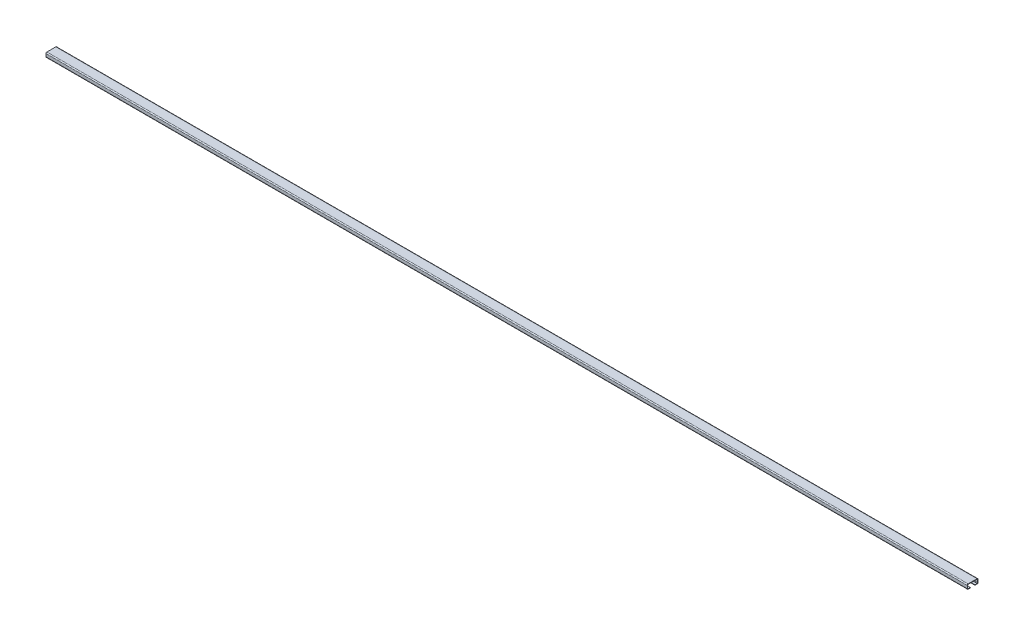
ISO-10303-21;
HEADER;
FILE_DESCRIPTION(('STEP AP214'),'2;1');
FILE_NAME('part.step','',(''),(''),'','','');
FILE_SCHEMA(('AUTOMOTIVE_DESIGN { 1 0 10303 214 1 1 1 1 }'));
ENDSEC;
DATA;
#1=APPLICATION_CONTEXT('core data for automotive mechanical design processes');
#2=APPLICATION_PROTOCOL_DEFINITION('international standard','automotive_design',2000,#1);
#3=PRODUCT_CONTEXT('',#1,'mechanical');
#4=PRODUCT('Part','Part','',(#3));
#5=PRODUCT_RELATED_PRODUCT_CATEGORY('part','',(#4));
#6=PRODUCT_DEFINITION_FORMATION('','',#4);
#7=PRODUCT_DEFINITION_CONTEXT('part definition',#1,'design');
#8=PRODUCT_DEFINITION('design','',#6,#7);
#9=PRODUCT_DEFINITION_SHAPE('','',#8);
#10=(LENGTH_UNIT() NAMED_UNIT(*) SI_UNIT(.MILLI.,.METRE.));
#11=(NAMED_UNIT(*) PLANE_ANGLE_UNIT() SI_UNIT($,.RADIAN.));
#12=(NAMED_UNIT(*) SI_UNIT($,.STERADIAN.) SOLID_ANGLE_UNIT());
#13=UNCERTAINTY_MEASURE_WITH_UNIT(LENGTH_MEASURE(1.E-05),#10,'distance_accuracy_value','');
#14=(GEOMETRIC_REPRESENTATION_CONTEXT(3) GLOBAL_UNCERTAINTY_ASSIGNED_CONTEXT((#13)) GLOBAL_UNIT_ASSIGNED_CONTEXT((#10,
#11,#12)) REPRESENTATION_CONTEXT('',''));
#15=CARTESIAN_POINT('',(0.,0.,0.));
#16=DIRECTION('',(0.,0.,1.));
#17=DIRECTION('',(1.,0.,0.));
#18=AXIS2_PLACEMENT_3D('',#15,#16,#17);
#19=CARTESIAN_POINT('',(-3000.,-27.25,-15.));
#20=DIRECTION('',(0.,0.,-1.));
#21=DIRECTION('',(-1.,0.,0.));
#22=AXIS2_PLACEMENT_3D('',#19,#20,#21);
#23=PLANE('',#22);
#24=DIRECTION('',(0.,1.,0.));
#25=VECTOR('',#24,1.);
#26=CARTESIAN_POINT('',(3000.,-27.25,-15.));
#27=LINE('',#26,#25);
#28=CARTESIAN_POINT('',(3000.,-30.,-15.));
#29=VERTEX_POINT('',#28);
#30=CARTESIAN_POINT('',(3000.,-27.25,-15.));
#31=VERTEX_POINT('',#30);
#32=EDGE_CURVE('E278',#29,#31,#27,.T.);
#33=ORIENTED_EDGE('',*,*,#32,.T.);
#34=DIRECTION('',(1.,0.,0.));
#35=VECTOR('',#34,1.);
#36=CARTESIAN_POINT('',(-3000.,-27.25,-15.));
#37=LINE('',#36,#35);
#38=CARTESIAN_POINT('',(-3000.,-27.25,-15.));
#39=VERTEX_POINT('',#38);
#40=EDGE_CURVE('E13',#39,#31,#37,.T.);
#41=ORIENTED_EDGE('',*,*,#40,.F.);
#42=DIRECTION('',(0.,1.,0.));
#43=VECTOR('',#42,1.);
#44=CARTESIAN_POINT('',(-3000.,-27.25,-15.));
#45=LINE('',#44,#43);
#46=CARTESIAN_POINT('',(-3000.,-30.,-15.));
#47=VERTEX_POINT('',#46);
#48=EDGE_CURVE('E336',#47,#39,#45,.T.);
#49=ORIENTED_EDGE('',*,*,#48,.F.);
#50=DIRECTION('',(1.,0.,0.));
#51=VECTOR('',#50,1.);
#52=CARTESIAN_POINT('',(-3000.,-30.,-15.));
#53=LINE('',#52,#51);
#54=EDGE_CURVE('E274',#47,#29,#53,.T.);
#55=ORIENTED_EDGE('',*,*,#54,.T.);
#56=EDGE_LOOP('',(#33,#41,#49,#55));
#57=FACE_BOUND('',#56,.T.);
#58=ADVANCED_FACE('F105',(#57),#23,.F.);
#59=CARTESIAN_POINT('',(-3000.,-27.25,-29.25));
#60=DIRECTION('',(0.,-1.,0.));
#61=DIRECTION('',(0.,0.,-1.));
#62=AXIS2_PLACEMENT_3D('',#59,#60,#61);
#63=PLANE('',#62);
#64=DIRECTION('',(0.,0.,-1.));
#65=VECTOR('',#64,1.);
#66=CARTESIAN_POINT('',(3000.,-27.25,-29.25));
#67=LINE('',#66,#65);
#68=CARTESIAN_POINT('',(3000.,-27.25,-29.25));
#69=VERTEX_POINT('',#68);
#70=EDGE_CURVE('E282',#31,#69,#67,.T.);
#71=ORIENTED_EDGE('',*,*,#70,.T.);
#72=DIRECTION('',(1.,0.,0.));
#73=VECTOR('',#72,1.);
#74=CARTESIAN_POINT('',(-3000.,-27.25,-29.25));
#75=LINE('',#74,#73);
#76=CARTESIAN_POINT('',(-3000.,-27.25,-29.25));
#77=VERTEX_POINT('',#76);
#78=EDGE_CURVE('E114',#77,#69,#75,.T.);
#79=ORIENTED_EDGE('',*,*,#78,.F.);
#80=DIRECTION('',(0.,0.,-1.));
#81=VECTOR('',#80,1.);
#82=CARTESIAN_POINT('',(-3000.,-27.25,-29.25));
#83=LINE('',#82,#81);
#84=EDGE_CURVE('E201',#39,#77,#83,.T.);
#85=ORIENTED_EDGE('',*,*,#84,.F.);
#86=ORIENTED_EDGE('',*,*,#40,.T.);
#87=EDGE_LOOP('',(#71,#79,#85,#86));
#88=FACE_BOUND('',#87,.T.);
#89=ADVANCED_FACE('F486',(#88),#63,.F.);
#90=CARTESIAN_POINT('',(-3000.,-24.25,-29.25));
#91=DIRECTION('',(1.,0.,0.));
#92=DIRECTION('',(0.,0.,-1.));
#93=AXIS2_PLACEMENT_3D('',#90,#91,#92);
#94=CYLINDRICAL_SURFACE('',#93,3.);
#95=CARTESIAN_POINT('',(3000.,-24.25,-29.25));
#96=DIRECTION('',(1.,0.,0.));
#97=DIRECTION('',(0.,0.,-1.));
#98=AXIS2_PLACEMENT_3D('',#95,#96,#97);
#99=CIRCLE('',#98,3.);
#100=CARTESIAN_POINT('',(3000.,-24.25,-32.25));
#101=VERTEX_POINT('',#100);
#102=EDGE_CURVE('E285',#69,#101,#99,.T.);
#103=ORIENTED_EDGE('',*,*,#102,.T.);
#104=DIRECTION('',(1.,0.,0.));
#105=VECTOR('',#104,1.);
#106=CARTESIAN_POINT('',(-3000.,-24.25,-32.25));
#107=LINE('',#106,#105);
#108=CARTESIAN_POINT('',(-3000.,-24.25,-32.25));
#109=VERTEX_POINT('',#108);
#110=EDGE_CURVE('E395',#109,#101,#107,.T.);
#111=ORIENTED_EDGE('',*,*,#110,.F.);
#112=CARTESIAN_POINT('',(-3000.,-24.25,-29.25));
#113=DIRECTION('',(1.,0.,0.));
#114=DIRECTION('',(0.,0.,-1.));
#115=AXIS2_PLACEMENT_3D('',#112,#113,#114);
#116=CIRCLE('',#115,3.);
#117=EDGE_CURVE('E405',#77,#109,#116,.T.);
#118=ORIENTED_EDGE('',*,*,#117,.F.);
#119=ORIENTED_EDGE('',*,*,#78,.T.);
#120=EDGE_LOOP('',(#103,#111,#118,#119));
#121=FACE_BOUND('',#120,.T.);
#122=ADVANCED_FACE('F403',(#121),#94,.F.);
#123=CARTESIAN_POINT('',(-3000.,-5.75000000000002,-32.25));
#124=DIRECTION('',(0.,0.,-1.));
#125=DIRECTION('',(-1.,0.,0.));
#126=AXIS2_PLACEMENT_3D('',#123,#124,#125);
#127=PLANE('',#126);
#128=DIRECTION('',(0.,1.,0.));
#129=VECTOR('',#128,1.);
#130=CARTESIAN_POINT('',(3000.,-5.75000000000002,-32.25));
#131=LINE('',#130,#129);
#132=CARTESIAN_POINT('',(3000.,-5.75000000000002,-32.25));
#133=VERTEX_POINT('',#132);
#134=EDGE_CURVE('E288',#101,#133,#131,.T.);
#135=ORIENTED_EDGE('',*,*,#134,.T.);
#136=DIRECTION('',(1.,0.,0.));
#137=VECTOR('',#136,1.);
#138=CARTESIAN_POINT('',(-3000.,-5.75000000000002,-32.25));
#139=LINE('',#138,#137);
#140=CARTESIAN_POINT('',(-3000.,-5.75000000000002,-32.25));
#141=VERTEX_POINT('',#140);
#142=EDGE_CURVE('E391',#141,#133,#139,.T.);
#143=ORIENTED_EDGE('',*,*,#142,.F.);
#144=DIRECTION('',(0.,1.,0.));
#145=VECTOR('',#144,1.);
#146=CARTESIAN_POINT('',(-3000.,-5.75000000000002,-32.25));
#147=LINE('',#146,#145);
#148=EDGE_CURVE('E424',#109,#141,#147,.T.);
#149=ORIENTED_EDGE('',*,*,#148,.F.);
#150=ORIENTED_EDGE('',*,*,#110,.T.);
#151=EDGE_LOOP('',(#135,#143,#149,#150));
#152=FACE_BOUND('',#151,.T.);
#153=ADVANCED_FACE('F414',(#152),#127,.F.);
#154=CARTESIAN_POINT('',(-3000.,-5.75,-29.25));
#155=DIRECTION('',(1.,0.,0.));
#156=DIRECTION('',(0.,0.,-1.));
#157=AXIS2_PLACEMENT_3D('',#154,#155,#156);
#158=CYLINDRICAL_SURFACE('',#157,3.);
#159=CARTESIAN_POINT('',(3000.,-5.75,-29.25));
#160=DIRECTION('',(1.,0.,0.));
#161=DIRECTION('',(0.,0.,-1.));
#162=AXIS2_PLACEMENT_3D('',#159,#160,#161);
#163=CIRCLE('',#162,3.);
#164=CARTESIAN_POINT('',(3000.,-2.75,-29.25));
#165=VERTEX_POINT('',#164);
#166=EDGE_CURVE('E291',#133,#165,#163,.T.);
#167=ORIENTED_EDGE('',*,*,#166,.T.);
#168=DIRECTION('',(1.,0.,0.));
#169=VECTOR('',#168,1.);
#170=CARTESIAN_POINT('',(-3000.,-2.75,-29.25));
#171=LINE('',#170,#169);
#172=CARTESIAN_POINT('',(-3000.,-2.75,-29.25));
#173=VERTEX_POINT('',#172);
#174=EDGE_CURVE('E387',#173,#165,#171,.T.);
#175=ORIENTED_EDGE('',*,*,#174,.F.);
#176=CARTESIAN_POINT('',(-3000.,-5.75,-29.25));
#177=DIRECTION('',(1.,0.,0.));
#178=DIRECTION('',(0.,0.,-1.));
#179=AXIS2_PLACEMENT_3D('',#176,#177,#178);
#180=CIRCLE('',#179,3.);
#181=EDGE_CURVE('E420',#141,#173,#180,.T.);
#182=ORIENTED_EDGE('',*,*,#181,.F.);
#183=ORIENTED_EDGE('',*,*,#142,.T.);
#184=EDGE_LOOP('',(#167,#175,#182,#183));
#185=FACE_BOUND('',#184,.T.);
#186=ADVANCED_FACE('F418',(#185),#158,.F.);
#187=CARTESIAN_POINT('',(-3000.,-2.75,-29.25));
#188=DIRECTION('',(0.,1.,0.));
#189=DIRECTION('',(0.,0.,1.));
#190=AXIS2_PLACEMENT_3D('',#187,#188,#189);
#191=PLANE('',#190);
#192=DIRECTION('',(0.,0.,1.));
#193=VECTOR('',#192,1.);
#194=CARTESIAN_POINT('',(3000.,-2.75,-29.25));
#195=LINE('',#194,#193);
#196=CARTESIAN_POINT('',(3000.,-2.75,29.25));
#197=VERTEX_POINT('',#196);
#198=EDGE_CURVE('E294',#165,#197,#195,.T.);
#199=ORIENTED_EDGE('',*,*,#198,.T.);
#200=DIRECTION('',(1.,0.,0.));
#201=VECTOR('',#200,1.);
#202=CARTESIAN_POINT('',(-3000.,-2.75,29.25));
#203=LINE('',#202,#201);
#204=CARTESIAN_POINT('',(-3000.,-2.75,29.25));
#205=VERTEX_POINT('',#204);
#206=EDGE_CURVE('E383',#205,#197,#203,.T.);
#207=ORIENTED_EDGE('',*,*,#206,.F.);
#208=DIRECTION('',(0.,0.,1.));
#209=VECTOR('',#208,1.);
#210=CARTESIAN_POINT('',(-3000.,-2.75,-29.25));
#211=LINE('',#210,#209);
#212=EDGE_CURVE('E423',#173,#205,#211,.T.);
#213=ORIENTED_EDGE('',*,*,#212,.F.);
#214=ORIENTED_EDGE('',*,*,#174,.T.);
#215=EDGE_LOOP('',(#199,#207,#213,#214));
#216=FACE_BOUND('',#215,.T.);
#217=ADVANCED_FACE('F499',(#216),#191,.F.);
#218=CARTESIAN_POINT('',(-3000.,-5.75,29.25));
#219=DIRECTION('',(1.,0.,0.));
#220=DIRECTION('',(0.,0.,-1.));
#221=AXIS2_PLACEMENT_3D('',#218,#219,#220);
#222=CYLINDRICAL_SURFACE('',#221,3.);
#223=CARTESIAN_POINT('',(3000.,-5.75,29.25));
#224=DIRECTION('',(1.,0.,0.));
#225=DIRECTION('',(0.,0.,-1.));
#226=AXIS2_PLACEMENT_3D('',#223,#224,#225);
#227=CIRCLE('',#226,3.);
#228=CARTESIAN_POINT('',(3000.,-5.75000000000002,32.25));
#229=VERTEX_POINT('',#228);
#230=EDGE_CURVE('E297',#197,#229,#227,.T.);
#231=ORIENTED_EDGE('',*,*,#230,.T.);
#232=DIRECTION('',(1.,0.,0.));
#233=VECTOR('',#232,1.);
#234=CARTESIAN_POINT('',(-3000.,-5.75000000000002,32.25));
#235=LINE('',#234,#233);
#236=CARTESIAN_POINT('',(-3000.,-5.75000000000002,32.25));
#237=VERTEX_POINT('',#236);
#238=EDGE_CURVE('E379',#237,#229,#235,.T.);
#239=ORIENTED_EDGE('',*,*,#238,.F.);
#240=CARTESIAN_POINT('',(-3000.,-5.75,29.25));
#241=DIRECTION('',(1.,0.,0.));
#242=DIRECTION('',(0.,0.,-1.));
#243=AXIS2_PLACEMENT_3D('',#240,#241,#242);
#244=CIRCLE('',#243,3.);
#245=EDGE_CURVE('E428',#205,#237,#244,.T.);
#246=ORIENTED_EDGE('',*,*,#245,.F.);
#247=ORIENTED_EDGE('',*,*,#206,.T.);
#248=EDGE_LOOP('',(#231,#239,#246,#247));
#249=FACE_BOUND('',#248,.T.);
#250=ADVANCED_FACE('F502',(#249),#222,.F.);
#251=CARTESIAN_POINT('',(-3000.,-5.75000000000002,32.25));
#252=DIRECTION('',(0.,0.,1.));
#253=DIRECTION('',(1.,0.,0.));
#254=AXIS2_PLACEMENT_3D('',#251,#252,#253);
#255=PLANE('',#254);
#256=DIRECTION('',(0.,-1.,0.));
#257=VECTOR('',#256,1.);
#258=CARTESIAN_POINT('',(3000.,-5.75000000000002,32.25));
#259=LINE('',#258,#257);
#260=CARTESIAN_POINT('',(3000.,-24.25,32.25));
#261=VERTEX_POINT('',#260);
#262=EDGE_CURVE('E300',#229,#261,#259,.T.);
#263=ORIENTED_EDGE('',*,*,#262,.T.);
#264=DIRECTION('',(1.,0.,0.));
#265=VECTOR('',#264,1.);
#266=CARTESIAN_POINT('',(-3000.,-24.25,32.25));
#267=LINE('',#266,#265);
#268=CARTESIAN_POINT('',(-3000.,-24.25,32.25));
#269=VERTEX_POINT('',#268);
#270=EDGE_CURVE('E375',#269,#261,#267,.T.);
#271=ORIENTED_EDGE('',*,*,#270,.F.);
#272=DIRECTION('',(0.,-1.,0.));
#273=VECTOR('',#272,1.);
#274=CARTESIAN_POINT('',(-3000.,-5.75000000000002,32.25));
#275=LINE('',#274,#273);
#276=EDGE_CURVE('E435',#237,#269,#275,.T.);
#277=ORIENTED_EDGE('',*,*,#276,.F.);
#278=ORIENTED_EDGE('',*,*,#238,.T.);
#279=EDGE_LOOP('',(#263,#271,#277,#278));
#280=FACE_BOUND('',#279,.T.);
#281=ADVANCED_FACE('F506',(#280),#255,.F.);
#282=CARTESIAN_POINT('',(-3000.,-24.25,29.25));
#283=DIRECTION('',(1.,0.,0.));
#284=DIRECTION('',(0.,0.,-1.));
#285=AXIS2_PLACEMENT_3D('',#282,#283,#284);
#286=CYLINDRICAL_SURFACE('',#285,3.);
#287=CARTESIAN_POINT('',(3000.,-24.25,29.25));
#288=DIRECTION('',(1.,0.,0.));
#289=DIRECTION('',(0.,0.,-1.));
#290=AXIS2_PLACEMENT_3D('',#287,#288,#289);
#291=CIRCLE('',#290,3.);
#292=CARTESIAN_POINT('',(3000.,-27.25,29.25));
#293=VERTEX_POINT('',#292);
#294=EDGE_CURVE('E303',#261,#293,#291,.T.);
#295=ORIENTED_EDGE('',*,*,#294,.T.);
#296=DIRECTION('',(1.,0.,0.));
#297=VECTOR('',#296,1.);
#298=CARTESIAN_POINT('',(-3000.,-27.25,29.25));
#299=LINE('',#298,#297);
#300=CARTESIAN_POINT('',(-3000.,-27.25,29.25));
#301=VERTEX_POINT('',#300);
#302=EDGE_CURVE('E371',#301,#293,#299,.T.);
#303=ORIENTED_EDGE('',*,*,#302,.F.);
#304=CARTESIAN_POINT('',(-3000.,-24.25,29.25));
#305=DIRECTION('',(1.,0.,0.));
#306=DIRECTION('',(0.,0.,-1.));
#307=AXIS2_PLACEMENT_3D('',#304,#305,#306);
#308=CIRCLE('',#307,3.);
#309=EDGE_CURVE('E438',#269,#301,#308,.T.);
#310=ORIENTED_EDGE('',*,*,#309,.F.);
#311=ORIENTED_EDGE('',*,*,#270,.T.);
#312=EDGE_LOOP('',(#295,#303,#310,#311));
#313=FACE_BOUND('',#312,.T.);
#314=ADVANCED_FACE('F510',(#313),#286,.F.);
#315=CARTESIAN_POINT('',(-3000.,-27.25,29.25));
#316=DIRECTION('',(0.,-1.,0.));
#317=DIRECTION('',(0.,0.,-1.));
#318=AXIS2_PLACEMENT_3D('',#315,#316,#317);
#319=PLANE('',#318);
#320=DIRECTION('',(0.,0.,-1.));
#321=VECTOR('',#320,1.);
#322=CARTESIAN_POINT('',(3000.,-27.25,29.25));
#323=LINE('',#322,#321);
#324=CARTESIAN_POINT('',(3000.,-27.25,15.));
#325=VERTEX_POINT('',#324);
#326=EDGE_CURVE('E306',#293,#325,#323,.T.);
#327=ORIENTED_EDGE('',*,*,#326,.T.);
#328=DIRECTION('',(1.,0.,0.));
#329=VECTOR('',#328,1.);
#330=CARTESIAN_POINT('',(-3000.,-27.25,15.));
#331=LINE('',#330,#329);
#332=CARTESIAN_POINT('',(-3000.,-27.25,15.));
#333=VERTEX_POINT('',#332);
#334=EDGE_CURVE('E367',#333,#325,#331,.T.);
#335=ORIENTED_EDGE('',*,*,#334,.F.);
#336=DIRECTION('',(0.,0.,-1.));
#337=VECTOR('',#336,1.);
#338=CARTESIAN_POINT('',(-3000.,-27.25,29.25));
#339=LINE('',#338,#337);
#340=EDGE_CURVE('E441',#301,#333,#339,.T.);
#341=ORIENTED_EDGE('',*,*,#340,.F.);
#342=ORIENTED_EDGE('',*,*,#302,.T.);
#343=EDGE_LOOP('',(#327,#335,#341,#342));
#344=FACE_BOUND('',#343,.T.);
#345=ADVANCED_FACE('F514',(#344),#319,.F.);
#346=CARTESIAN_POINT('',(-3000.,-27.25,15.));
#347=DIRECTION('',(0.,0.,1.));
#348=DIRECTION('',(1.,0.,0.));
#349=AXIS2_PLACEMENT_3D('',#346,#347,#348);
#350=PLANE('',#349);
#351=DIRECTION('',(0.,-1.,0.));
#352=VECTOR('',#351,1.);
#353=CARTESIAN_POINT('',(3000.,-27.25,15.));
#354=LINE('',#353,#352);
#355=CARTESIAN_POINT('',(3000.,-30.,15.));
#356=VERTEX_POINT('',#355);
#357=EDGE_CURVE('E309',#325,#356,#354,.T.);
#358=ORIENTED_EDGE('',*,*,#357,.T.);
#359=DIRECTION('',(1.,0.,0.));
#360=VECTOR('',#359,1.);
#361=CARTESIAN_POINT('',(-3000.,-30.,15.));
#362=LINE('',#361,#360);
#363=CARTESIAN_POINT('',(-3000.,-30.,15.));
#364=VERTEX_POINT('',#363);
#365=EDGE_CURVE('E363',#364,#356,#362,.T.);
#366=ORIENTED_EDGE('',*,*,#365,.F.);
#367=DIRECTION('',(0.,-1.,0.));
#368=VECTOR('',#367,1.);
#369=CARTESIAN_POINT('',(-3000.,-27.25,15.));
#370=LINE('',#369,#368);
#371=EDGE_CURVE('E444',#333,#364,#370,.T.);
#372=ORIENTED_EDGE('',*,*,#371,.F.);
#373=ORIENTED_EDGE('',*,*,#334,.T.);
#374=EDGE_LOOP('',(#358,#366,#372,#373));
#375=FACE_BOUND('',#374,.T.);
#376=ADVANCED_FACE('F518',(#375),#350,.F.);
#377=CARTESIAN_POINT('',(-3000.,-30.,28.8));
#378=DIRECTION('',(0.,1.,0.));
#379=DIRECTION('',(0.,0.,1.));
#380=AXIS2_PLACEMENT_3D('',#377,#378,#379);
#381=PLANE('',#380);
#382=DIRECTION('',(0.,0.,1.));
#383=VECTOR('',#382,1.);
#384=CARTESIAN_POINT('',(3000.,-30.,28.8));
#385=LINE('',#384,#383);
#386=CARTESIAN_POINT('',(3000.,-30.,28.8));
#387=VERTEX_POINT('',#386);
#388=EDGE_CURVE('E312',#356,#387,#385,.T.);
#389=ORIENTED_EDGE('',*,*,#388,.T.);
#390=DIRECTION('',(1.,0.,0.));
#391=VECTOR('',#390,1.);
#392=CARTESIAN_POINT('',(-3000.,-30.,28.8));
#393=LINE('',#392,#391);
#394=CARTESIAN_POINT('',(-3000.,-30.,28.8));
#395=VERTEX_POINT('',#394);
#396=EDGE_CURVE('E359',#395,#387,#393,.T.);
#397=ORIENTED_EDGE('',*,*,#396,.F.);
#398=DIRECTION('',(0.,0.,1.));
#399=VECTOR('',#398,1.);
#400=CARTESIAN_POINT('',(-3000.,-30.,28.8));
#401=LINE('',#400,#399);
#402=EDGE_CURVE('E447',#364,#395,#401,.T.);
#403=ORIENTED_EDGE('',*,*,#402,.F.);
#404=ORIENTED_EDGE('',*,*,#365,.T.);
#405=EDGE_LOOP('',(#389,#397,#403,#404));
#406=FACE_BOUND('',#405,.T.);
#407=ADVANCED_FACE('F522',(#406),#381,.F.);
#408=CARTESIAN_POINT('',(-3000.,-23.8,28.8));
#409=DIRECTION('',(1.,0.,0.));
#410=DIRECTION('',(0.,0.,-1.));
#411=AXIS2_PLACEMENT_3D('',#408,#409,#410);
#412=CYLINDRICAL_SURFACE('',#411,6.2);
#413=CARTESIAN_POINT('',(3000.,-23.8,28.8));
#414=DIRECTION('',(-1.,0.,0.));
#415=DIRECTION('',(0.,0.,-1.));
#416=AXIS2_PLACEMENT_3D('',#413,#414,#415);
#417=CIRCLE('',#416,6.2);
#418=CARTESIAN_POINT('',(3000.,-23.7999999999999,35.));
#419=VERTEX_POINT('',#418);
#420=EDGE_CURVE('E315',#387,#419,#417,.T.);
#421=ORIENTED_EDGE('',*,*,#420,.T.);
#422=DIRECTION('',(1.,0.,0.));
#423=VECTOR('',#422,1.);
#424=CARTESIAN_POINT('',(-3000.,-23.7999999999999,35.));
#425=LINE('',#424,#423);
#426=CARTESIAN_POINT('',(-3000.,-23.7999999999999,35.));
#427=VERTEX_POINT('',#426);
#428=EDGE_CURVE('E355',#427,#419,#425,.T.);
#429=ORIENTED_EDGE('',*,*,#428,.F.);
#430=CARTESIAN_POINT('',(-3000.,-23.8,28.8));
#431=DIRECTION('',(-1.,0.,0.));
#432=DIRECTION('',(0.,0.,-1.));
#433=AXIS2_PLACEMENT_3D('',#430,#431,#432);
#434=CIRCLE('',#433,6.2);
#435=EDGE_CURVE('E450',#395,#427,#434,.T.);
#436=ORIENTED_EDGE('',*,*,#435,.F.);
#437=ORIENTED_EDGE('',*,*,#396,.T.);
#438=EDGE_LOOP('',(#421,#429,#436,#437));
#439=FACE_BOUND('',#438,.T.);
#440=ADVANCED_FACE('F526',(#439),#412,.T.);
#441=CARTESIAN_POINT('',(-3000.,-6.20000000000003,35.));
#442=DIRECTION('',(0.,0.,-1.));
#443=DIRECTION('',(-1.,0.,0.));
#444=AXIS2_PLACEMENT_3D('',#441,#442,#443);
#445=PLANE('',#444);
#446=DIRECTION('',(0.,1.,0.));
#447=VECTOR('',#446,1.);
#448=CARTESIAN_POINT('',(3000.,-6.20000000000003,35.));
#449=LINE('',#448,#447);
#450=CARTESIAN_POINT('',(3000.,-6.20000000000003,35.));
#451=VERTEX_POINT('',#450);
#452=EDGE_CURVE('E318',#419,#451,#449,.T.);
#453=ORIENTED_EDGE('',*,*,#452,.T.);
#454=DIRECTION('',(1.,0.,0.));
#455=VECTOR('',#454,1.);
#456=CARTESIAN_POINT('',(-3000.,-6.20000000000003,35.));
#457=LINE('',#456,#455);
#458=CARTESIAN_POINT('',(-3000.,-6.20000000000003,35.));
#459=VERTEX_POINT('',#458);
#460=EDGE_CURVE('E351',#459,#451,#457,.T.);
#461=ORIENTED_EDGE('',*,*,#460,.F.);
#462=DIRECTION('',(0.,1.,0.));
#463=VECTOR('',#462,1.);
#464=CARTESIAN_POINT('',(-3000.,-6.20000000000003,35.));
#465=LINE('',#464,#463);
#466=EDGE_CURVE('E453',#427,#459,#465,.T.);
#467=ORIENTED_EDGE('',*,*,#466,.F.);
#468=ORIENTED_EDGE('',*,*,#428,.T.);
#469=EDGE_LOOP('',(#453,#461,#467,#468));
#470=FACE_BOUND('',#469,.T.);
#471=ADVANCED_FACE('F530',(#470),#445,.F.);
#472=CARTESIAN_POINT('',(-3000.,-6.19999999999999,28.8));
#473=DIRECTION('',(1.,0.,0.));
#474=DIRECTION('',(0.,0.,-1.));
#475=AXIS2_PLACEMENT_3D('',#472,#473,#474);
#476=CYLINDRICAL_SURFACE('',#475,6.2);
#477=CARTESIAN_POINT('',(3000.,-6.19999999999999,28.8));
#478=DIRECTION('',(-1.,0.,0.));
#479=DIRECTION('',(0.,0.,1.));
#480=AXIS2_PLACEMENT_3D('',#477,#478,#479);
#481=CIRCLE('',#480,6.2);
#482=CARTESIAN_POINT('',(3000.,0.,28.8));
#483=VERTEX_POINT('',#482);
#484=EDGE_CURVE('E321',#451,#483,#481,.T.);
#485=ORIENTED_EDGE('',*,*,#484,.T.);
#486=DIRECTION('',(1.,0.,0.));
#487=VECTOR('',#486,1.);
#488=CARTESIAN_POINT('',(-3000.,0.,28.8));
#489=LINE('',#488,#487);
#490=CARTESIAN_POINT('',(-3000.,0.,28.8));
#491=VERTEX_POINT('',#490);
#492=EDGE_CURVE('E347',#491,#483,#489,.T.);
#493=ORIENTED_EDGE('',*,*,#492,.F.);
#494=CARTESIAN_POINT('',(-3000.,-6.19999999999999,28.8));
#495=DIRECTION('',(-1.,0.,0.));
#496=DIRECTION('',(0.,0.,1.));
#497=AXIS2_PLACEMENT_3D('',#494,#495,#496);
#498=CIRCLE('',#497,6.2);
#499=EDGE_CURVE('E456',#459,#491,#498,.T.);
#500=ORIENTED_EDGE('',*,*,#499,.F.);
#501=ORIENTED_EDGE('',*,*,#460,.T.);
#502=EDGE_LOOP('',(#485,#493,#500,#501));
#503=FACE_BOUND('',#502,.T.);
#504=ADVANCED_FACE('F534',(#503),#476,.T.);
#505=CARTESIAN_POINT('',(-3000.,0.,-28.8));
#506=DIRECTION('',(0.,-1.,0.));
#507=DIRECTION('',(0.,0.,-1.));
#508=AXIS2_PLACEMENT_3D('',#505,#506,#507);
#509=PLANE('',#508);
#510=DIRECTION('',(0.,0.,-1.));
#511=VECTOR('',#510,1.);
#512=CARTESIAN_POINT('',(3000.,0.,-28.8));
#513=LINE('',#512,#511);
#514=CARTESIAN_POINT('',(3000.,0.,-28.8));
#515=VERTEX_POINT('',#514);
#516=EDGE_CURVE('E324',#483,#515,#513,.T.);
#517=ORIENTED_EDGE('',*,*,#516,.T.);
#518=DIRECTION('',(1.,0.,0.));
#519=VECTOR('',#518,1.);
#520=CARTESIAN_POINT('',(-3000.,0.,-28.8));
#521=LINE('',#520,#519);
#522=CARTESIAN_POINT('',(-3000.,0.,-28.8));
#523=VERTEX_POINT('',#522);
#524=EDGE_CURVE('E343',#523,#515,#521,.T.);
#525=ORIENTED_EDGE('',*,*,#524,.F.);
#526=DIRECTION('',(0.,0.,-1.));
#527=VECTOR('',#526,1.);
#528=CARTESIAN_POINT('',(-3000.,0.,-28.8));
#529=LINE('',#528,#527);
#530=EDGE_CURVE('E459',#491,#523,#529,.T.);
#531=ORIENTED_EDGE('',*,*,#530,.F.);
#532=ORIENTED_EDGE('',*,*,#492,.T.);
#533=EDGE_LOOP('',(#517,#525,#531,#532));
#534=FACE_BOUND('',#533,.T.);
#535=ADVANCED_FACE('F467',(#534),#509,.F.);
#536=CARTESIAN_POINT('',(-3000.,-6.2,-28.8));
#537=DIRECTION('',(1.,0.,0.));
#538=DIRECTION('',(0.,0.,-1.));
#539=AXIS2_PLACEMENT_3D('',#536,#537,#538);
#540=CYLINDRICAL_SURFACE('',#539,6.2);
#541=CARTESIAN_POINT('',(3000.,-6.2,-28.8));
#542=DIRECTION('',(-1.,0.,0.));
#543=DIRECTION('',(0.,0.,1.));
#544=AXIS2_PLACEMENT_3D('',#541,#542,#543);
#545=CIRCLE('',#544,6.2);
#546=CARTESIAN_POINT('',(3000.,-6.20000000000004,-35.));
#547=VERTEX_POINT('',#546);
#548=EDGE_CURVE('E327',#515,#547,#545,.T.);
#549=ORIENTED_EDGE('',*,*,#548,.T.);
#550=DIRECTION('',(1.,0.,0.));
#551=VECTOR('',#550,1.);
#552=CARTESIAN_POINT('',(-3000.,-6.20000000000004,-35.));
#553=LINE('',#552,#551);
#554=CARTESIAN_POINT('',(-3000.,-6.20000000000004,-35.));
#555=VERTEX_POINT('',#554);
#556=EDGE_CURVE('E267',#555,#547,#553,.T.);
#557=ORIENTED_EDGE('',*,*,#556,.F.);
#558=CARTESIAN_POINT('',(-3000.,-6.2,-28.8));
#559=DIRECTION('',(-1.,0.,0.));
#560=DIRECTION('',(0.,0.,1.));
#561=AXIS2_PLACEMENT_3D('',#558,#559,#560);
#562=CIRCLE('',#561,6.2);
#563=EDGE_CURVE('E256',#523,#555,#562,.T.);
#564=ORIENTED_EDGE('',*,*,#563,.F.);
#565=ORIENTED_EDGE('',*,*,#524,.T.);
#566=EDGE_LOOP('',(#549,#557,#564,#565));
#567=FACE_BOUND('',#566,.T.);
#568=ADVANCED_FACE('F471',(#567),#540,.T.);
#569=CARTESIAN_POINT('',(-3000.,-6.20000000000004,-35.));
#570=DIRECTION('',(0.,0.,1.));
#571=DIRECTION('',(1.,0.,0.));
#572=AXIS2_PLACEMENT_3D('',#569,#570,#571);
#573=PLANE('',#572);
#574=DIRECTION('',(0.,-1.,0.));
#575=VECTOR('',#574,1.);
#576=CARTESIAN_POINT('',(3000.,-6.20000000000004,-35.));
#577=LINE('',#576,#575);
#578=CARTESIAN_POINT('',(3000.,-23.8,-35.));
#579=VERTEX_POINT('',#578);
#580=EDGE_CURVE('E265',#547,#579,#577,.T.);
#581=ORIENTED_EDGE('',*,*,#580,.T.);
#582=DIRECTION('',(1.,0.,0.));
#583=VECTOR('',#582,1.);
#584=CARTESIAN_POINT('',(-3000.,-23.8,-35.));
#585=LINE('',#584,#583);
#586=CARTESIAN_POINT('',(-3000.,-23.8,-35.));
#587=VERTEX_POINT('',#586);
#588=EDGE_CURVE('E262',#587,#579,#585,.T.);
#589=ORIENTED_EDGE('',*,*,#588,.F.);
#590=DIRECTION('',(0.,-1.,0.));
#591=VECTOR('',#590,1.);
#592=CARTESIAN_POINT('',(-3000.,-6.20000000000004,-35.));
#593=LINE('',#592,#591);
#594=EDGE_CURVE('E250',#555,#587,#593,.T.);
#595=ORIENTED_EDGE('',*,*,#594,.F.);
#596=ORIENTED_EDGE('',*,*,#556,.T.);
#597=EDGE_LOOP('',(#581,#589,#595,#596));
#598=FACE_BOUND('',#597,.T.);
#599=ADVANCED_FACE('F263',(#598),#573,.F.);
#600=CARTESIAN_POINT('',(-3000.,-23.8,-28.8));
#601=DIRECTION('',(1.,0.,0.));
#602=DIRECTION('',(0.,0.,-1.));
#603=AXIS2_PLACEMENT_3D('',#600,#601,#602);
#604=CYLINDRICAL_SURFACE('',#603,6.2);
#605=CARTESIAN_POINT('',(3000.,-23.8,-28.8));
#606=DIRECTION('',(-1.,0.,0.));
#607=DIRECTION('',(0.,0.,-1.));
#608=AXIS2_PLACEMENT_3D('',#605,#606,#607);
#609=CIRCLE('',#608,6.2);
#610=CARTESIAN_POINT('',(3000.,-30.,-28.8));
#611=VERTEX_POINT('',#610);
#612=EDGE_CURVE('E187',#579,#611,#609,.T.);
#613=ORIENTED_EDGE('',*,*,#612,.T.);
#614=DIRECTION('',(1.,0.,0.));
#615=VECTOR('',#614,1.);
#616=CARTESIAN_POINT('',(-3000.,-30.,-28.8));
#617=LINE('',#616,#615);
#618=CARTESIAN_POINT('',(-3000.,-30.,-28.8));
#619=VERTEX_POINT('',#618);
#620=EDGE_CURVE('E268',#619,#611,#617,.T.);
#621=ORIENTED_EDGE('',*,*,#620,.F.);
#622=CARTESIAN_POINT('',(-3000.,-23.8,-28.8));
#623=DIRECTION('',(-1.,0.,0.));
#624=DIRECTION('',(0.,0.,-1.));
#625=AXIS2_PLACEMENT_3D('',#622,#623,#624);
#626=CIRCLE('',#625,6.2);
#627=EDGE_CURVE('E254',#587,#619,#626,.T.);
#628=ORIENTED_EDGE('',*,*,#627,.F.);
#629=ORIENTED_EDGE('',*,*,#588,.T.);
#630=EDGE_LOOP('',(#613,#621,#628,#629));
#631=FACE_BOUND('',#630,.T.);
#632=ADVANCED_FACE('F270',(#631),#604,.T.);
#633=CARTESIAN_POINT('',(-3000.,-30.,-28.8));
#634=DIRECTION('',(0.,1.,0.));
#635=DIRECTION('',(0.,0.,1.));
#636=AXIS2_PLACEMENT_3D('',#633,#634,#635);
#637=PLANE('',#636);
#638=DIRECTION('',(0.,0.,1.));
#639=VECTOR('',#638,1.);
#640=CARTESIAN_POINT('',(3000.,-30.,-28.8));
#641=LINE('',#640,#639);
#642=EDGE_CURVE('E193',#611,#29,#641,.T.);
#643=ORIENTED_EDGE('',*,*,#642,.T.);
#644=ORIENTED_EDGE('',*,*,#54,.F.);
#645=DIRECTION('',(0.,0.,1.));
#646=VECTOR('',#645,1.);
#647=CARTESIAN_POINT('',(-3000.,-30.,-28.8));
#648=LINE('',#647,#646);
#649=EDGE_CURVE('E122',#619,#47,#648,.T.);
#650=ORIENTED_EDGE('',*,*,#649,.F.);
#651=ORIENTED_EDGE('',*,*,#620,.T.);
#652=EDGE_LOOP('',(#643,#644,#650,#651));
#653=FACE_BOUND('',#652,.T.);
#654=ADVANCED_FACE('F475',(#653),#637,.F.);
#655=CARTESIAN_POINT('',(-3000.,-23.8,-28.8));
#656=DIRECTION('',(1.,0.,0.));
#657=DIRECTION('',(0.,0.,-1.));
#658=AXIS2_PLACEMENT_3D('',#655,#656,#657);
#659=PLANE('',#658);
#660=ORIENTED_EDGE('',*,*,#48,.T.);
#661=ORIENTED_EDGE('',*,*,#84,.T.);
#662=ORIENTED_EDGE('',*,*,#117,.T.);
#663=ORIENTED_EDGE('',*,*,#148,.T.);
#664=ORIENTED_EDGE('',*,*,#181,.T.);
#665=ORIENTED_EDGE('',*,*,#212,.T.);
#666=ORIENTED_EDGE('',*,*,#245,.T.);
#667=ORIENTED_EDGE('',*,*,#276,.T.);
#668=ORIENTED_EDGE('',*,*,#309,.T.);
#669=ORIENTED_EDGE('',*,*,#340,.T.);
#670=ORIENTED_EDGE('',*,*,#371,.T.);
#671=ORIENTED_EDGE('',*,*,#402,.T.);
#672=ORIENTED_EDGE('',*,*,#435,.T.);
#673=ORIENTED_EDGE('',*,*,#466,.T.);
#674=ORIENTED_EDGE('',*,*,#499,.T.);
#675=ORIENTED_EDGE('',*,*,#530,.T.);
#676=ORIENTED_EDGE('',*,*,#563,.T.);
#677=ORIENTED_EDGE('',*,*,#594,.T.);
#678=ORIENTED_EDGE('',*,*,#627,.T.);
#679=ORIENTED_EDGE('',*,*,#649,.T.);
#680=EDGE_LOOP('',(#660,#661,#662,#663,#664,#665,#666,#667,#668,#669,#670,#671,#672,#673,#674,
#675,#676,#677,#678,#679));
#681=FACE_BOUND('',#680,.T.);
#682=ADVANCED_FACE('F252',(#681),#659,.F.);
#683=CARTESIAN_POINT('',(3000.,-23.8,-28.8));
#684=DIRECTION('',(1.,0.,0.));
#685=DIRECTION('',(0.,0.,-1.));
#686=AXIS2_PLACEMENT_3D('',#683,#684,#685);
#687=PLANE('',#686);
#688=ORIENTED_EDGE('',*,*,#32,.F.);
#689=ORIENTED_EDGE('',*,*,#642,.F.);
#690=ORIENTED_EDGE('',*,*,#612,.F.);
#691=ORIENTED_EDGE('',*,*,#580,.F.);
#692=ORIENTED_EDGE('',*,*,#548,.F.);
#693=ORIENTED_EDGE('',*,*,#516,.F.);
#694=ORIENTED_EDGE('',*,*,#484,.F.);
#695=ORIENTED_EDGE('',*,*,#452,.F.);
#696=ORIENTED_EDGE('',*,*,#420,.F.);
#697=ORIENTED_EDGE('',*,*,#388,.F.);
#698=ORIENTED_EDGE('',*,*,#357,.F.);
#699=ORIENTED_EDGE('',*,*,#326,.F.);
#700=ORIENTED_EDGE('',*,*,#294,.F.);
#701=ORIENTED_EDGE('',*,*,#262,.F.);
#702=ORIENTED_EDGE('',*,*,#230,.F.);
#703=ORIENTED_EDGE('',*,*,#198,.F.);
#704=ORIENTED_EDGE('',*,*,#166,.F.);
#705=ORIENTED_EDGE('',*,*,#134,.F.);
#706=ORIENTED_EDGE('',*,*,#102,.F.);
#707=ORIENTED_EDGE('',*,*,#70,.F.);
#708=EDGE_LOOP('',(#688,#689,#690,#691,#692,#693,#694,#695,#696,#697,#698,#699,#700,#701,#702,
#703,#704,#705,#706,#707));
#709=FACE_BOUND('',#708,.T.);
#710=ADVANCED_FACE('F409',(#709),#687,.T.);
#711=CLOSED_SHELL('',(#58,#89,#122,#153,#186,#217,#250,#281,#314,#345,#376,#407,#440,#471,#504,
#535,#568,#599,#632,#654,#682,#710));
#712=MANIFOLD_SOLID_BREP('B2',#711);
#713=ADVANCED_BREP_SHAPE_REPRESENTATION('',(#18,#712),#14);
#714=SHAPE_DEFINITION_REPRESENTATION(#9,#713);
ENDSEC;
END-ISO-10303-21;
